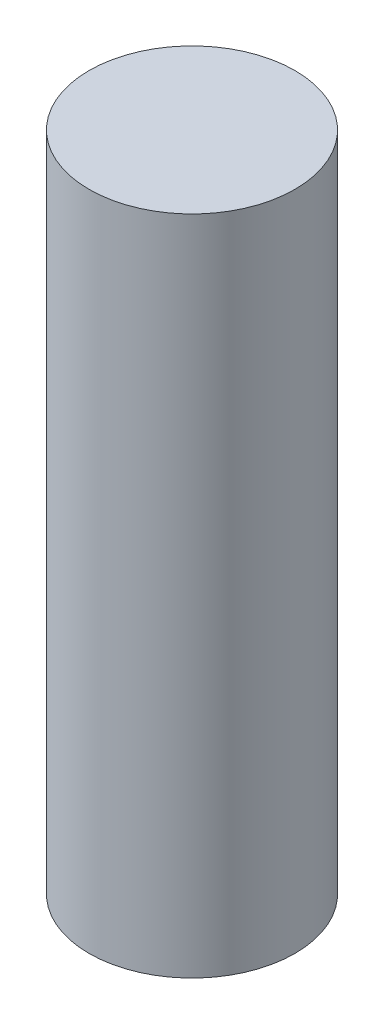
ISO-10303-21;
HEADER;
FILE_DESCRIPTION(('STEP AP214'),'2;1');
FILE_NAME('part.step','',(''),(''),'','','');
FILE_SCHEMA(('AUTOMOTIVE_DESIGN { 1 0 10303 214 1 1 1 1 }'));
ENDSEC;
DATA;
#1=APPLICATION_CONTEXT('core data for automotive mechanical design processes');
#2=APPLICATION_PROTOCOL_DEFINITION('international standard','automotive_design',2000,#1);
#3=PRODUCT_CONTEXT('',#1,'mechanical');
#4=PRODUCT('Part','Part','',(#3));
#5=PRODUCT_RELATED_PRODUCT_CATEGORY('part','',(#4));
#6=PRODUCT_DEFINITION_FORMATION('','',#4);
#7=PRODUCT_DEFINITION_CONTEXT('part definition',#1,'design');
#8=PRODUCT_DEFINITION('design','',#6,#7);
#9=PRODUCT_DEFINITION_SHAPE('','',#8);
#10=(LENGTH_UNIT() NAMED_UNIT(*) SI_UNIT(.MILLI.,.METRE.));
#11=(NAMED_UNIT(*) PLANE_ANGLE_UNIT() SI_UNIT($,.RADIAN.));
#12=(NAMED_UNIT(*) SI_UNIT($,.STERADIAN.) SOLID_ANGLE_UNIT());
#13=UNCERTAINTY_MEASURE_WITH_UNIT(LENGTH_MEASURE(1.E-05),#10,'distance_accuracy_value','');
#14=(GEOMETRIC_REPRESENTATION_CONTEXT(3) GLOBAL_UNCERTAINTY_ASSIGNED_CONTEXT((#13)) GLOBAL_UNIT_ASSIGNED_CONTEXT((#10,
#11,#12)) REPRESENTATION_CONTEXT('',''));
#15=CARTESIAN_POINT('',(0.,0.,0.));
#16=DIRECTION('',(0.,0.,1.));
#17=DIRECTION('',(1.,0.,0.));
#18=AXIS2_PLACEMENT_3D('',#15,#16,#17);
#19=CARTESIAN_POINT('',(0.,9.,0.));
#20=DIRECTION('',(0.,-1.,0.));
#21=DIRECTION('',(0.,0.,-1.));
#22=AXIS2_PLACEMENT_3D('',#19,#20,#21);
#23=CYLINDRICAL_SURFACE('',#22,1.4);
#24=CARTESIAN_POINT('',(0.,9.,0.));
#25=DIRECTION('',(0.,1.,0.));
#26=DIRECTION('',(0.,0.,1.));
#27=AXIS2_PLACEMENT_3D('',#24,#25,#26);
#28=CIRCLE('',#27,1.4);
#29=CARTESIAN_POINT('',(0.,9.,1.4));
#30=VERTEX_POINT('',#29);
#31=EDGE_CURVE('E10',#30,#30,#28,.T.);
#32=ORIENTED_EDGE('',*,*,#31,.F.);
#33=EDGE_LOOP('',(#32));
#34=FACE_BOUND('',#33,.T.);
#35=CARTESIAN_POINT('',(0.,0.,0.));
#36=DIRECTION('',(0.,1.,0.));
#37=DIRECTION('',(0.,0.,1.));
#38=AXIS2_PLACEMENT_3D('',#35,#36,#37);
#39=CIRCLE('',#38,1.4);
#40=CARTESIAN_POINT('',(0.,0.,1.4));
#41=VERTEX_POINT('',#40);
#42=EDGE_CURVE('E38',#41,#41,#39,.T.);
#43=ORIENTED_EDGE('',*,*,#42,.T.);
#44=EDGE_LOOP('',(#43));
#45=FACE_BOUND('',#44,.T.);
#46=ADVANCED_FACE('F35',(#34,#45),#23,.T.);
#47=CARTESIAN_POINT('',(0.,9.,0.));
#48=DIRECTION('',(0.,1.,0.));
#49=DIRECTION('',(0.,0.,1.));
#50=AXIS2_PLACEMENT_3D('',#47,#48,#49);
#51=PLANE('',#50);
#52=ORIENTED_EDGE('',*,*,#31,.T.);
#53=EDGE_LOOP('',(#52));
#54=FACE_BOUND('',#53,.T.);
#55=ADVANCED_FACE('F50',(#54),#51,.T.);
#56=CARTESIAN_POINT('',(0.,0.,0.));
#57=DIRECTION('',(0.,1.,0.));
#58=DIRECTION('',(0.,0.,1.));
#59=AXIS2_PLACEMENT_3D('',#56,#57,#58);
#60=PLANE('',#59);
#61=ORIENTED_EDGE('',*,*,#42,.F.);
#62=EDGE_LOOP('',(#61));
#63=FACE_BOUND('',#62,.T.);
#64=ADVANCED_FACE('F48',(#63),#60,.F.);
#65=CLOSED_SHELL('',(#46,#55,#64));
#66=MANIFOLD_SOLID_BREP('B2',#65);
#67=ADVANCED_BREP_SHAPE_REPRESENTATION('',(#18,#66),#14);
#68=SHAPE_DEFINITION_REPRESENTATION(#9,#67);
ENDSEC;
END-ISO-10303-21;
